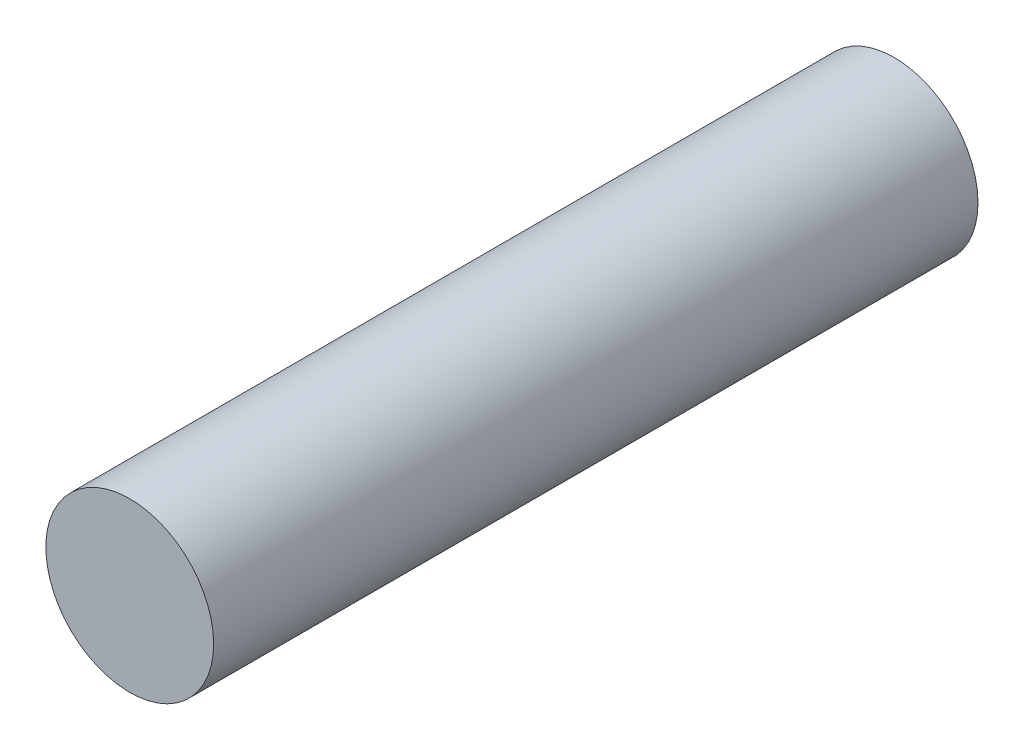
ISO-10303-21;
HEADER;
FILE_DESCRIPTION(('STEP AP214'),'2;1');
FILE_NAME('part.step','',(''),(''),'','','');
FILE_SCHEMA(('AUTOMOTIVE_DESIGN { 1 0 10303 214 1 1 1 1 }'));
ENDSEC;
DATA;
#1=APPLICATION_CONTEXT('core data for automotive mechanical design processes');
#2=APPLICATION_PROTOCOL_DEFINITION('international standard','automotive_design',2000,#1);
#3=PRODUCT_CONTEXT('',#1,'mechanical');
#4=PRODUCT('Part','Part','',(#3));
#5=PRODUCT_RELATED_PRODUCT_CATEGORY('part','',(#4));
#6=PRODUCT_DEFINITION_FORMATION('','',#4);
#7=PRODUCT_DEFINITION_CONTEXT('part definition',#1,'design');
#8=PRODUCT_DEFINITION('design','',#6,#7);
#9=PRODUCT_DEFINITION_SHAPE('','',#8);
#10=(LENGTH_UNIT() NAMED_UNIT(*) SI_UNIT(.MILLI.,.METRE.));
#11=(NAMED_UNIT(*) PLANE_ANGLE_UNIT() SI_UNIT($,.RADIAN.));
#12=(NAMED_UNIT(*) SI_UNIT($,.STERADIAN.) SOLID_ANGLE_UNIT());
#13=UNCERTAINTY_MEASURE_WITH_UNIT(LENGTH_MEASURE(1.E-05),#10,'distance_accuracy_value','');
#14=(GEOMETRIC_REPRESENTATION_CONTEXT(3) GLOBAL_UNCERTAINTY_ASSIGNED_CONTEXT((#13)) GLOBAL_UNIT_ASSIGNED_CONTEXT((#10,
#11,#12)) REPRESENTATION_CONTEXT('',''));
#15=CARTESIAN_POINT('',(0.,0.,0.));
#16=DIRECTION('',(0.,0.,1.));
#17=DIRECTION('',(1.,0.,0.));
#18=AXIS2_PLACEMENT_3D('',#15,#16,#17);
#19=CARTESIAN_POINT('',(0.,0.,41.));
#20=DIRECTION('',(0.,0.,-1.));
#21=DIRECTION('',(-1.,0.,0.));
#22=AXIS2_PLACEMENT_3D('',#19,#20,#21);
#23=CYLINDRICAL_SURFACE('',#22,4.5);
#24=CARTESIAN_POINT('',(0.,0.,41.));
#25=DIRECTION('',(0.,0.,1.));
#26=DIRECTION('',(1.,0.,0.));
#27=AXIS2_PLACEMENT_3D('',#24,#25,#26);
#28=CIRCLE('',#27,4.5);
#29=CARTESIAN_POINT('',(4.5,0.,41.));
#30=VERTEX_POINT('',#29);
#31=EDGE_CURVE('E10',#30,#30,#28,.T.);
#32=ORIENTED_EDGE('',*,*,#31,.F.);
#33=EDGE_LOOP('',(#32));
#34=FACE_BOUND('',#33,.T.);
#35=CARTESIAN_POINT('',(0.,0.,0.));
#36=DIRECTION('',(0.,0.,1.));
#37=DIRECTION('',(1.,0.,0.));
#38=AXIS2_PLACEMENT_3D('',#35,#36,#37);
#39=CIRCLE('',#38,4.5);
#40=CARTESIAN_POINT('',(4.5,0.,0.));
#41=VERTEX_POINT('',#40);
#42=EDGE_CURVE('E46',#41,#41,#39,.T.);
#43=ORIENTED_EDGE('',*,*,#42,.T.);
#44=EDGE_LOOP('',(#43));
#45=FACE_BOUND('',#44,.T.);
#46=ADVANCED_FACE('F43',(#34,#45),#23,.T.);
#47=CARTESIAN_POINT('',(0.,0.,41.));
#48=DIRECTION('',(0.,0.,1.));
#49=DIRECTION('',(1.,0.,0.));
#50=AXIS2_PLACEMENT_3D('',#47,#48,#49);
#51=PLANE('',#50);
#52=ORIENTED_EDGE('',*,*,#31,.T.);
#53=EDGE_LOOP('',(#52));
#54=FACE_BOUND('',#53,.T.);
#55=ADVANCED_FACE('F58',(#54),#51,.T.);
#56=CARTESIAN_POINT('',(0.,0.,0.));
#57=DIRECTION('',(0.,0.,1.));
#58=DIRECTION('',(1.,0.,0.));
#59=AXIS2_PLACEMENT_3D('',#56,#57,#58);
#60=PLANE('',#59);
#61=ORIENTED_EDGE('',*,*,#42,.F.);
#62=EDGE_LOOP('',(#61));
#63=FACE_BOUND('',#62,.T.);
#64=ADVANCED_FACE('F56',(#63),#60,.F.);
#65=CLOSED_SHELL('',(#46,#55,#64));
#66=MANIFOLD_SOLID_BREP('B2',#65);
#67=ADVANCED_BREP_SHAPE_REPRESENTATION('',(#18,#66),#14);
#68=SHAPE_DEFINITION_REPRESENTATION(#9,#67);
ENDSEC;
END-ISO-10303-21;
